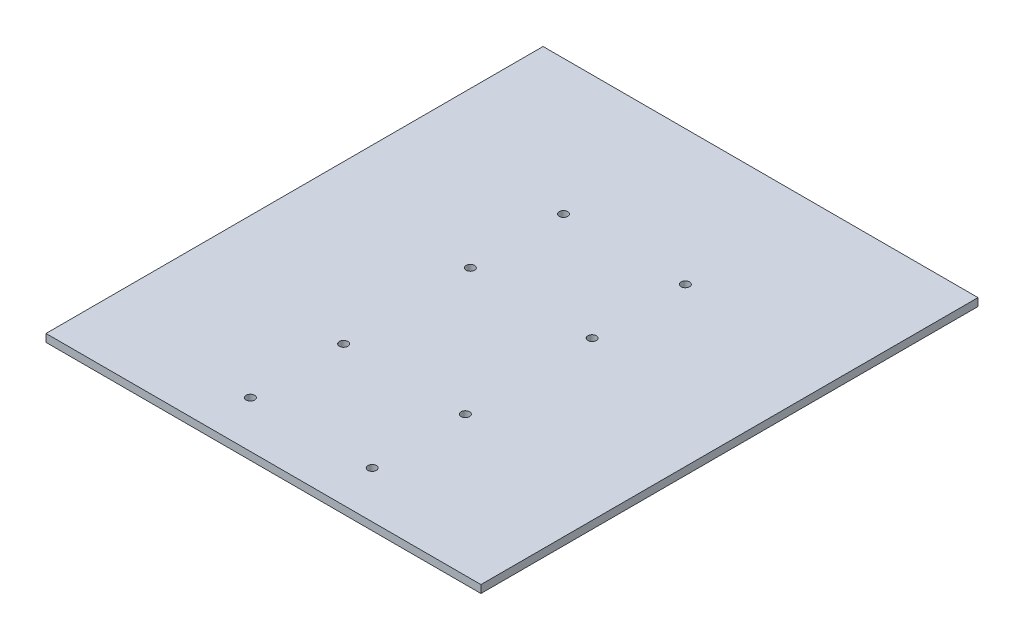
ISO-10303-21;
HEADER;
FILE_DESCRIPTION(('STEP AP214'),'2;1');
FILE_NAME('part.step','',(''),(''),'','','');
FILE_SCHEMA(('AUTOMOTIVE_DESIGN { 1 0 10303 214 1 1 1 1 }'));
ENDSEC;
DATA;
#1=APPLICATION_CONTEXT('core data for automotive mechanical design processes');
#2=APPLICATION_PROTOCOL_DEFINITION('international standard','automotive_design',2000,#1);
#3=PRODUCT_CONTEXT('',#1,'mechanical');
#4=PRODUCT('Part','Part','',(#3));
#5=PRODUCT_RELATED_PRODUCT_CATEGORY('part','',(#4));
#6=PRODUCT_DEFINITION_FORMATION('','',#4);
#7=PRODUCT_DEFINITION_CONTEXT('part definition',#1,'design');
#8=PRODUCT_DEFINITION('design','',#6,#7);
#9=PRODUCT_DEFINITION_SHAPE('','',#8);
#10=(LENGTH_UNIT() NAMED_UNIT(*) SI_UNIT(.MILLI.,.METRE.));
#11=(NAMED_UNIT(*) PLANE_ANGLE_UNIT() SI_UNIT($,.RADIAN.));
#12=(NAMED_UNIT(*) SI_UNIT($,.STERADIAN.) SOLID_ANGLE_UNIT());
#13=UNCERTAINTY_MEASURE_WITH_UNIT(LENGTH_MEASURE(1.E-05),#10,'distance_accuracy_value','');
#14=(GEOMETRIC_REPRESENTATION_CONTEXT(3) GLOBAL_UNCERTAINTY_ASSIGNED_CONTEXT((#13)) GLOBAL_UNIT_ASSIGNED_CONTEXT((#10,
#11,#12)) REPRESENTATION_CONTEXT('',''));
#15=CARTESIAN_POINT('',(0.,0.,0.));
#16=DIRECTION('',(0.,0.,1.));
#17=DIRECTION('',(1.,0.,0.));
#18=AXIS2_PLACEMENT_3D('',#15,#16,#17);
#19=CARTESIAN_POINT('',(0.,3.175,0.));
#20=DIRECTION('',(0.,-1.,0.));
#21=DIRECTION('',(0.,0.,-1.));
#22=AXIS2_PLACEMENT_3D('',#19,#20,#21);
#23=PLANE('',#22);
#24=CARTESIAN_POINT('',(-114.299999999993,3.175,55.1271199999899));
#25=DIRECTION('',(0.,1.,0.));
#26=DIRECTION('',(0.,0.,1.));
#27=AXIS2_PLACEMENT_3D('',#24,#25,#26);
#28=CIRCLE('',#27,1.72719999999998);
#29=CARTESIAN_POINT('',(-114.299999999993,3.175,56.8543199999899));
#30=VERTEX_POINT('',#29);
#31=EDGE_CURVE('E157',#30,#30,#28,.T.);
#32=ORIENTED_EDGE('',*,*,#31,.F.);
#33=EDGE_LOOP('',(#32));
#34=FACE_BOUND('',#33,.T.);
#35=DIRECTION('',(0.,0.,-1.));
#36=VECTOR('',#35,1.);
#37=CARTESIAN_POINT('',(0.,3.175,0.));
#38=LINE('',#37,#36);
#39=CARTESIAN_POINT('',(0.,3.175,203.2));
#40=VERTEX_POINT('',#39);
#41=CARTESIAN_POINT('',(0.,3.175,0.));
#42=VERTEX_POINT('',#41);
#43=EDGE_CURVE('E87',#40,#42,#38,.T.);
#44=ORIENTED_EDGE('',*,*,#43,.T.);
#45=DIRECTION('',(-1.,0.,0.));
#46=VECTOR('',#45,1.);
#47=CARTESIAN_POINT('',(0.,3.175,0.));
#48=LINE('',#47,#46);
#49=CARTESIAN_POINT('',(-177.8,3.175,0.));
#50=VERTEX_POINT('',#49);
#51=EDGE_CURVE('E82',#42,#50,#48,.T.);
#52=ORIENTED_EDGE('',*,*,#51,.T.);
#53=DIRECTION('',(0.,0.,1.));
#54=VECTOR('',#53,1.);
#55=CARTESIAN_POINT('',(-177.8,3.175,0.));
#56=LINE('',#55,#54);
#57=CARTESIAN_POINT('',(-177.8,3.175,203.2));
#58=VERTEX_POINT('',#57);
#59=EDGE_CURVE('E85',#50,#58,#56,.T.);
#60=ORIENTED_EDGE('',*,*,#59,.T.);
#61=DIRECTION('',(1.,0.,0.));
#62=VECTOR('',#61,1.);
#63=CARTESIAN_POINT('',(0.,3.175,203.2));
#64=LINE('',#63,#62);
#65=EDGE_CURVE('E52',#58,#40,#64,.T.);
#66=ORIENTED_EDGE('',*,*,#65,.T.);
#67=EDGE_LOOP('',(#44,#52,#60,#66));
#68=FACE_BOUND('',#67,.T.);
#69=CARTESIAN_POINT('',(-63.5,3.175,146.05));
#70=DIRECTION('',(0.,1.,0.));
#71=DIRECTION('',(0.,0.,1.));
#72=AXIS2_PLACEMENT_3D('',#69,#70,#71);
#73=CIRCLE('',#72,1.72719999999998);
#74=CARTESIAN_POINT('',(-63.5,3.175,147.7772));
#75=VERTEX_POINT('',#74);
#76=EDGE_CURVE('E115',#75,#75,#73,.T.);
#77=ORIENTED_EDGE('',*,*,#76,.F.);
#78=EDGE_LOOP('',(#77));
#79=FACE_BOUND('',#78,.T.);
#80=CARTESIAN_POINT('',(-63.5,3.175,184.15));
#81=DIRECTION('',(0.,1.,0.));
#82=DIRECTION('',(0.,0.,1.));
#83=AXIS2_PLACEMENT_3D('',#80,#81,#82);
#84=CIRCLE('',#83,1.72719999999998);
#85=CARTESIAN_POINT('',(-63.5,3.175,185.8772));
#86=VERTEX_POINT('',#85);
#87=EDGE_CURVE('E121',#86,#86,#84,.T.);
#88=ORIENTED_EDGE('',*,*,#87,.F.);
#89=EDGE_LOOP('',(#88));
#90=FACE_BOUND('',#89,.T.);
#91=CARTESIAN_POINT('',(-113.288406095308,3.175,184.15));
#92=DIRECTION('',(0.,1.,0.));
#93=DIRECTION('',(0.,0.,1.));
#94=AXIS2_PLACEMENT_3D('',#91,#92,#93);
#95=CIRCLE('',#94,1.72719999999998);
#96=CARTESIAN_POINT('',(-113.288406095308,3.175,185.8772));
#97=VERTEX_POINT('',#96);
#98=EDGE_CURVE('E127',#97,#97,#95,.T.);
#99=ORIENTED_EDGE('',*,*,#98,.F.);
#100=EDGE_LOOP('',(#99));
#101=FACE_BOUND('',#100,.T.);
#102=CARTESIAN_POINT('',(-113.288406095308,3.175,146.05));
#103=DIRECTION('',(0.,1.,0.));
#104=DIRECTION('',(0.,0.,1.));
#105=AXIS2_PLACEMENT_3D('',#102,#103,#104);
#106=CIRCLE('',#105,1.72719999999998);
#107=CARTESIAN_POINT('',(-113.288406095308,3.175,147.7772));
#108=VERTEX_POINT('',#107);
#109=EDGE_CURVE('E133',#108,#108,#106,.T.);
#110=ORIENTED_EDGE('',*,*,#109,.F.);
#111=EDGE_LOOP('',(#110));
#112=FACE_BOUND('',#111,.T.);
#113=CARTESIAN_POINT('',(-114.299999999993,3.175,93.22711999999));
#114=DIRECTION('',(0.,1.,0.));
#115=DIRECTION('',(0.,0.,1.));
#116=AXIS2_PLACEMENT_3D('',#113,#114,#115);
#117=CIRCLE('',#116,1.72719999999998);
#118=CARTESIAN_POINT('',(-114.299999999993,3.175,94.9543199999899));
#119=VERTEX_POINT('',#118);
#120=EDGE_CURVE('E139',#119,#119,#117,.T.);
#121=ORIENTED_EDGE('',*,*,#120,.F.);
#122=EDGE_LOOP('',(#121));
#123=FACE_BOUND('',#122,.T.);
#124=CARTESIAN_POINT('',(-64.5115939046847,3.175,93.2271199999895));
#125=DIRECTION('',(0.,1.,0.));
#126=DIRECTION('',(0.,0.,1.));
#127=AXIS2_PLACEMENT_3D('',#124,#125,#126);
#128=CIRCLE('',#127,1.72719999999998);
#129=CARTESIAN_POINT('',(-64.5115939046847,3.175,94.9543199999895));
#130=VERTEX_POINT('',#129);
#131=EDGE_CURVE('E145',#130,#130,#128,.T.);
#132=ORIENTED_EDGE('',*,*,#131,.F.);
#133=EDGE_LOOP('',(#132));
#134=FACE_BOUND('',#133,.T.);
#135=CARTESIAN_POINT('',(-64.511593904685,3.175,55.1271199999895));
#136=DIRECTION('',(0.,1.,0.));
#137=DIRECTION('',(0.,0.,1.));
#138=AXIS2_PLACEMENT_3D('',#135,#136,#137);
#139=CIRCLE('',#138,1.72719999999998);
#140=CARTESIAN_POINT('',(-64.511593904685,3.175,56.8543199999895));
#141=VERTEX_POINT('',#140);
#142=EDGE_CURVE('E151',#141,#141,#139,.T.);
#143=ORIENTED_EDGE('',*,*,#142,.F.);
#144=EDGE_LOOP('',(#143));
#145=FACE_BOUND('',#144,.T.);
#146=ADVANCED_FACE('F35',(#34,#68,#79,#90,#101,#112,#123,#134,#145),#23,.F.);
#147=CARTESIAN_POINT('',(0.,3.175,0.));
#148=DIRECTION('',(-1.,0.,0.));
#149=DIRECTION('',(0.,0.,1.));
#150=AXIS2_PLACEMENT_3D('',#147,#148,#149);
#151=PLANE('',#150);
#152=DIRECTION('',(0.,0.,-1.));
#153=VECTOR('',#152,1.);
#154=CARTESIAN_POINT('',(0.,0.,0.));
#155=LINE('',#154,#153);
#156=CARTESIAN_POINT('',(0.,0.,203.2));
#157=VERTEX_POINT('',#156);
#158=CARTESIAN_POINT('',(0.,0.,0.));
#159=VERTEX_POINT('',#158);
#160=EDGE_CURVE('E99',#157,#159,#155,.T.);
#161=ORIENTED_EDGE('',*,*,#160,.T.);
#162=DIRECTION('',(0.,-1.,0.));
#163=VECTOR('',#162,1.);
#164=CARTESIAN_POINT('',(0.,3.175,0.));
#165=LINE('',#164,#163);
#166=EDGE_CURVE('E11',#42,#159,#165,.T.);
#167=ORIENTED_EDGE('',*,*,#166,.F.);
#168=ORIENTED_EDGE('',*,*,#43,.F.);
#169=DIRECTION('',(0.,-1.,0.));
#170=VECTOR('',#169,1.);
#171=CARTESIAN_POINT('',(0.,3.175,203.2));
#172=LINE('',#171,#170);
#173=EDGE_CURVE('E95',#40,#157,#172,.T.);
#174=ORIENTED_EDGE('',*,*,#173,.T.);
#175=EDGE_LOOP('',(#161,#167,#168,#174));
#176=FACE_BOUND('',#175,.T.);
#177=ADVANCED_FACE('F37',(#176),#151,.F.);
#178=CARTESIAN_POINT('',(0.,3.175,0.));
#179=DIRECTION('',(0.,0.,1.));
#180=DIRECTION('',(1.,0.,0.));
#181=AXIS2_PLACEMENT_3D('',#178,#179,#180);
#182=PLANE('',#181);
#183=DIRECTION('',(-1.,0.,0.));
#184=VECTOR('',#183,1.);
#185=CARTESIAN_POINT('',(0.,0.,0.));
#186=LINE('',#185,#184);
#187=CARTESIAN_POINT('',(-177.8,0.,0.));
#188=VERTEX_POINT('',#187);
#189=EDGE_CURVE('E91',#159,#188,#186,.T.);
#190=ORIENTED_EDGE('',*,*,#189,.T.);
#191=DIRECTION('',(0.,-1.,0.));
#192=VECTOR('',#191,1.);
#193=CARTESIAN_POINT('',(-177.8,3.175,0.));
#194=LINE('',#193,#192);
#195=EDGE_CURVE('E44',#50,#188,#194,.T.);
#196=ORIENTED_EDGE('',*,*,#195,.F.);
#197=ORIENTED_EDGE('',*,*,#51,.F.);
#198=ORIENTED_EDGE('',*,*,#166,.T.);
#199=EDGE_LOOP('',(#190,#196,#197,#198));
#200=FACE_BOUND('',#199,.T.);
#201=ADVANCED_FACE('F90',(#200),#182,.F.);
#202=CARTESIAN_POINT('',(-177.8,3.175,0.));
#203=DIRECTION('',(1.,0.,0.));
#204=DIRECTION('',(0.,0.,-1.));
#205=AXIS2_PLACEMENT_3D('',#202,#203,#204);
#206=PLANE('',#205);
#207=DIRECTION('',(0.,0.,1.));
#208=VECTOR('',#207,1.);
#209=CARTESIAN_POINT('',(-177.8,0.,0.));
#210=LINE('',#209,#208);
#211=CARTESIAN_POINT('',(-177.8,0.,203.2));
#212=VERTEX_POINT('',#211);
#213=EDGE_CURVE('E69',#188,#212,#210,.T.);
#214=ORIENTED_EDGE('',*,*,#213,.T.);
#215=DIRECTION('',(0.,-1.,0.));
#216=VECTOR('',#215,1.);
#217=CARTESIAN_POINT('',(-177.8,3.175,203.2));
#218=LINE('',#217,#216);
#219=EDGE_CURVE('E92',#58,#212,#218,.T.);
#220=ORIENTED_EDGE('',*,*,#219,.F.);
#221=ORIENTED_EDGE('',*,*,#59,.F.);
#222=ORIENTED_EDGE('',*,*,#195,.T.);
#223=EDGE_LOOP('',(#214,#220,#221,#222));
#224=FACE_BOUND('',#223,.T.);
#225=ADVANCED_FACE('F93',(#224),#206,.F.);
#226=CARTESIAN_POINT('',(0.,3.175,203.2));
#227=DIRECTION('',(0.,0.,-1.));
#228=DIRECTION('',(-1.,0.,0.));
#229=AXIS2_PLACEMENT_3D('',#226,#227,#228);
#230=PLANE('',#229);
#231=DIRECTION('',(1.,0.,0.));
#232=VECTOR('',#231,1.);
#233=CARTESIAN_POINT('',(0.,0.,203.2));
#234=LINE('',#233,#232);
#235=EDGE_CURVE('E75',#212,#157,#234,.T.);
#236=ORIENTED_EDGE('',*,*,#235,.T.);
#237=ORIENTED_EDGE('',*,*,#173,.F.);
#238=ORIENTED_EDGE('',*,*,#65,.F.);
#239=ORIENTED_EDGE('',*,*,#219,.T.);
#240=EDGE_LOOP('',(#236,#237,#238,#239));
#241=FACE_BOUND('',#240,.T.);
#242=ADVANCED_FACE('F107',(#241),#230,.F.);
#243=CARTESIAN_POINT('',(0.,0.,0.));
#244=DIRECTION('',(0.,-1.,0.));
#245=DIRECTION('',(0.,0.,-1.));
#246=AXIS2_PLACEMENT_3D('',#243,#244,#245);
#247=PLANE('',#246);
#248=CARTESIAN_POINT('',(-114.299999999993,0.,55.1271199999899));
#249=DIRECTION('',(0.,-1.,0.));
#250=DIRECTION('',(0.,0.,-1.));
#251=AXIS2_PLACEMENT_3D('',#248,#249,#250);
#252=CIRCLE('',#251,1.72719999999999);
#253=CARTESIAN_POINT('',(-114.299999999993,0.,53.39991999999));
#254=VERTEX_POINT('',#253);
#255=EDGE_CURVE('E154',#254,#254,#252,.T.);
#256=ORIENTED_EDGE('',*,*,#255,.F.);
#257=EDGE_LOOP('',(#256));
#258=FACE_BOUND('',#257,.T.);
#259=CARTESIAN_POINT('',(-64.511593904685,0.,55.1271199999895));
#260=DIRECTION('',(0.,-1.,0.));
#261=DIRECTION('',(0.,0.,-1.));
#262=AXIS2_PLACEMENT_3D('',#259,#260,#261);
#263=CIRCLE('',#262,1.72719999999999);
#264=CARTESIAN_POINT('',(-64.511593904685,0.,53.3999199999895));
#265=VERTEX_POINT('',#264);
#266=EDGE_CURVE('E148',#265,#265,#263,.T.);
#267=ORIENTED_EDGE('',*,*,#266,.F.);
#268=EDGE_LOOP('',(#267));
#269=FACE_BOUND('',#268,.T.);
#270=CARTESIAN_POINT('',(-64.5115939046847,0.,93.2271199999895));
#271=DIRECTION('',(0.,-1.,0.));
#272=DIRECTION('',(0.,0.,-1.));
#273=AXIS2_PLACEMENT_3D('',#270,#271,#272);
#274=CIRCLE('',#273,1.72719999999999);
#275=CARTESIAN_POINT('',(-64.5115939046847,0.,91.4999199999895));
#276=VERTEX_POINT('',#275);
#277=EDGE_CURVE('E142',#276,#276,#274,.T.);
#278=ORIENTED_EDGE('',*,*,#277,.F.);
#279=EDGE_LOOP('',(#278));
#280=FACE_BOUND('',#279,.T.);
#281=CARTESIAN_POINT('',(-114.299999999993,0.,93.22711999999));
#282=DIRECTION('',(0.,-1.,0.));
#283=DIRECTION('',(0.,0.,-1.));
#284=AXIS2_PLACEMENT_3D('',#281,#282,#283);
#285=CIRCLE('',#284,1.72719999999999);
#286=CARTESIAN_POINT('',(-114.299999999993,0.,91.49991999999));
#287=VERTEX_POINT('',#286);
#288=EDGE_CURVE('E136',#287,#287,#285,.T.);
#289=ORIENTED_EDGE('',*,*,#288,.F.);
#290=EDGE_LOOP('',(#289));
#291=FACE_BOUND('',#290,.T.);
#292=CARTESIAN_POINT('',(-113.288406095308,0.,146.05));
#293=DIRECTION('',(0.,-1.,0.));
#294=DIRECTION('',(0.,0.,-1.));
#295=AXIS2_PLACEMENT_3D('',#292,#293,#294);
#296=CIRCLE('',#295,1.72719999999999);
#297=CARTESIAN_POINT('',(-113.288406095308,0.,144.3228));
#298=VERTEX_POINT('',#297);
#299=EDGE_CURVE('E130',#298,#298,#296,.T.);
#300=ORIENTED_EDGE('',*,*,#299,.F.);
#301=EDGE_LOOP('',(#300));
#302=FACE_BOUND('',#301,.T.);
#303=CARTESIAN_POINT('',(-113.288406095308,0.,184.15));
#304=DIRECTION('',(0.,-1.,0.));
#305=DIRECTION('',(0.,0.,-1.));
#306=AXIS2_PLACEMENT_3D('',#303,#304,#305);
#307=CIRCLE('',#306,1.72719999999999);
#308=CARTESIAN_POINT('',(-113.288406095308,0.,182.4228));
#309=VERTEX_POINT('',#308);
#310=EDGE_CURVE('E124',#309,#309,#307,.T.);
#311=ORIENTED_EDGE('',*,*,#310,.F.);
#312=EDGE_LOOP('',(#311));
#313=FACE_BOUND('',#312,.T.);
#314=CARTESIAN_POINT('',(-63.5,0.,184.15));
#315=DIRECTION('',(0.,-1.,0.));
#316=DIRECTION('',(0.,0.,-1.));
#317=AXIS2_PLACEMENT_3D('',#314,#315,#316);
#318=CIRCLE('',#317,1.72719999999999);
#319=CARTESIAN_POINT('',(-63.5,0.,182.4228));
#320=VERTEX_POINT('',#319);
#321=EDGE_CURVE('E118',#320,#320,#318,.T.);
#322=ORIENTED_EDGE('',*,*,#321,.F.);
#323=EDGE_LOOP('',(#322));
#324=FACE_BOUND('',#323,.T.);
#325=CARTESIAN_POINT('',(-63.5,0.,146.05));
#326=DIRECTION('',(0.,-1.,0.));
#327=DIRECTION('',(0.,0.,-1.));
#328=AXIS2_PLACEMENT_3D('',#325,#326,#327);
#329=CIRCLE('',#328,1.72719999999999);
#330=CARTESIAN_POINT('',(-63.5,0.,144.3228));
#331=VERTEX_POINT('',#330);
#332=EDGE_CURVE('E102',#331,#331,#329,.T.);
#333=ORIENTED_EDGE('',*,*,#332,.F.);
#334=EDGE_LOOP('',(#333));
#335=FACE_BOUND('',#334,.T.);
#336=ORIENTED_EDGE('',*,*,#160,.F.);
#337=ORIENTED_EDGE('',*,*,#235,.F.);
#338=ORIENTED_EDGE('',*,*,#213,.F.);
#339=ORIENTED_EDGE('',*,*,#189,.F.);
#340=EDGE_LOOP('',(#336,#337,#338,#339));
#341=FACE_BOUND('',#340,.T.);
#342=ADVANCED_FACE('F110',(#258,#269,#280,#291,#302,#313,#324,#335,#341),#247,.T.);
#343=CARTESIAN_POINT('',(-63.5,3.175,146.05));
#344=DIRECTION('',(0.,1.,0.));
#345=DIRECTION('',(0.,0.,1.));
#346=AXIS2_PLACEMENT_3D('',#343,#344,#345);
#347=CYLINDRICAL_SURFACE('',#346,1.72719999999999);
#348=ORIENTED_EDGE('',*,*,#76,.T.);
#349=EDGE_LOOP('',(#348));
#350=FACE_BOUND('',#349,.T.);
#351=ORIENTED_EDGE('',*,*,#332,.T.);
#352=EDGE_LOOP('',(#351));
#353=FACE_BOUND('',#352,.T.);
#354=ADVANCED_FACE('F173',(#350,#353),#347,.F.);
#355=CARTESIAN_POINT('',(-63.5,3.175,184.15));
#356=DIRECTION('',(0.,1.,0.));
#357=DIRECTION('',(0.,0.,1.));
#358=AXIS2_PLACEMENT_3D('',#355,#356,#357);
#359=CYLINDRICAL_SURFACE('',#358,1.72719999999999);
#360=ORIENTED_EDGE('',*,*,#87,.T.);
#361=EDGE_LOOP('',(#360));
#362=FACE_BOUND('',#361,.T.);
#363=ORIENTED_EDGE('',*,*,#321,.T.);
#364=EDGE_LOOP('',(#363));
#365=FACE_BOUND('',#364,.T.);
#366=ADVANCED_FACE('F209',(#362,#365),#359,.F.);
#367=CARTESIAN_POINT('',(-113.288406095308,3.175,184.15));
#368=DIRECTION('',(0.,1.,0.));
#369=DIRECTION('',(0.,0.,1.));
#370=AXIS2_PLACEMENT_3D('',#367,#368,#369);
#371=CYLINDRICAL_SURFACE('',#370,1.72719999999999);
#372=ORIENTED_EDGE('',*,*,#98,.T.);
#373=EDGE_LOOP('',(#372));
#374=FACE_BOUND('',#373,.T.);
#375=ORIENTED_EDGE('',*,*,#310,.T.);
#376=EDGE_LOOP('',(#375));
#377=FACE_BOUND('',#376,.T.);
#378=ADVANCED_FACE('F215',(#374,#377),#371,.F.);
#379=CARTESIAN_POINT('',(-113.288406095308,3.175,146.05));
#380=DIRECTION('',(0.,1.,0.));
#381=DIRECTION('',(0.,0.,1.));
#382=AXIS2_PLACEMENT_3D('',#379,#380,#381);
#383=CYLINDRICAL_SURFACE('',#382,1.72719999999999);
#384=ORIENTED_EDGE('',*,*,#109,.T.);
#385=EDGE_LOOP('',(#384));
#386=FACE_BOUND('',#385,.T.);
#387=ORIENTED_EDGE('',*,*,#299,.T.);
#388=EDGE_LOOP('',(#387));
#389=FACE_BOUND('',#388,.T.);
#390=ADVANCED_FACE('F222',(#386,#389),#383,.F.);
#391=CARTESIAN_POINT('',(-114.299999999993,3.175,93.22711999999));
#392=DIRECTION('',(0.,1.,0.));
#393=DIRECTION('',(0.,0.,1.));
#394=AXIS2_PLACEMENT_3D('',#391,#392,#393);
#395=CYLINDRICAL_SURFACE('',#394,1.72719999999999);
#396=ORIENTED_EDGE('',*,*,#120,.T.);
#397=EDGE_LOOP('',(#396));
#398=FACE_BOUND('',#397,.T.);
#399=ORIENTED_EDGE('',*,*,#288,.T.);
#400=EDGE_LOOP('',(#399));
#401=FACE_BOUND('',#400,.T.);
#402=ADVANCED_FACE('F230',(#398,#401),#395,.F.);
#403=CARTESIAN_POINT('',(-64.5115939046847,3.175,93.2271199999895));
#404=DIRECTION('',(0.,1.,0.));
#405=DIRECTION('',(0.,0.,1.));
#406=AXIS2_PLACEMENT_3D('',#403,#404,#405);
#407=CYLINDRICAL_SURFACE('',#406,1.72719999999999);
#408=ORIENTED_EDGE('',*,*,#131,.T.);
#409=EDGE_LOOP('',(#408));
#410=FACE_BOUND('',#409,.T.);
#411=ORIENTED_EDGE('',*,*,#277,.T.);
#412=EDGE_LOOP('',(#411));
#413=FACE_BOUND('',#412,.T.);
#414=ADVANCED_FACE('F238',(#410,#413),#407,.F.);
#415=CARTESIAN_POINT('',(-64.511593904685,3.175,55.1271199999895));
#416=DIRECTION('',(0.,1.,0.));
#417=DIRECTION('',(0.,0.,1.));
#418=AXIS2_PLACEMENT_3D('',#415,#416,#417);
#419=CYLINDRICAL_SURFACE('',#418,1.72719999999999);
#420=ORIENTED_EDGE('',*,*,#142,.T.);
#421=EDGE_LOOP('',(#420));
#422=FACE_BOUND('',#421,.T.);
#423=ORIENTED_EDGE('',*,*,#266,.T.);
#424=EDGE_LOOP('',(#423));
#425=FACE_BOUND('',#424,.T.);
#426=ADVANCED_FACE('F246',(#422,#425),#419,.F.);
#427=CARTESIAN_POINT('',(-114.299999999993,3.175,55.1271199999899));
#428=DIRECTION('',(0.,1.,0.));
#429=DIRECTION('',(0.,0.,1.));
#430=AXIS2_PLACEMENT_3D('',#427,#428,#429);
#431=CYLINDRICAL_SURFACE('',#430,1.72719999999999);
#432=ORIENTED_EDGE('',*,*,#31,.T.);
#433=EDGE_LOOP('',(#432));
#434=FACE_BOUND('',#433,.T.);
#435=ORIENTED_EDGE('',*,*,#255,.T.);
#436=EDGE_LOOP('',(#435));
#437=FACE_BOUND('',#436,.T.);
#438=ADVANCED_FACE('F161',(#434,#437),#431,.F.);
#439=CLOSED_SHELL('',(#146,#177,#201,#225,#242,#342,#354,#366,#378,#390,#402,#414,#426,#438));
#440=MANIFOLD_SOLID_BREP('B2',#439);
#441=ADVANCED_BREP_SHAPE_REPRESENTATION('',(#18,#440),#14);
#442=SHAPE_DEFINITION_REPRESENTATION(#9,#441);
ENDSEC;
END-ISO-10303-21;
